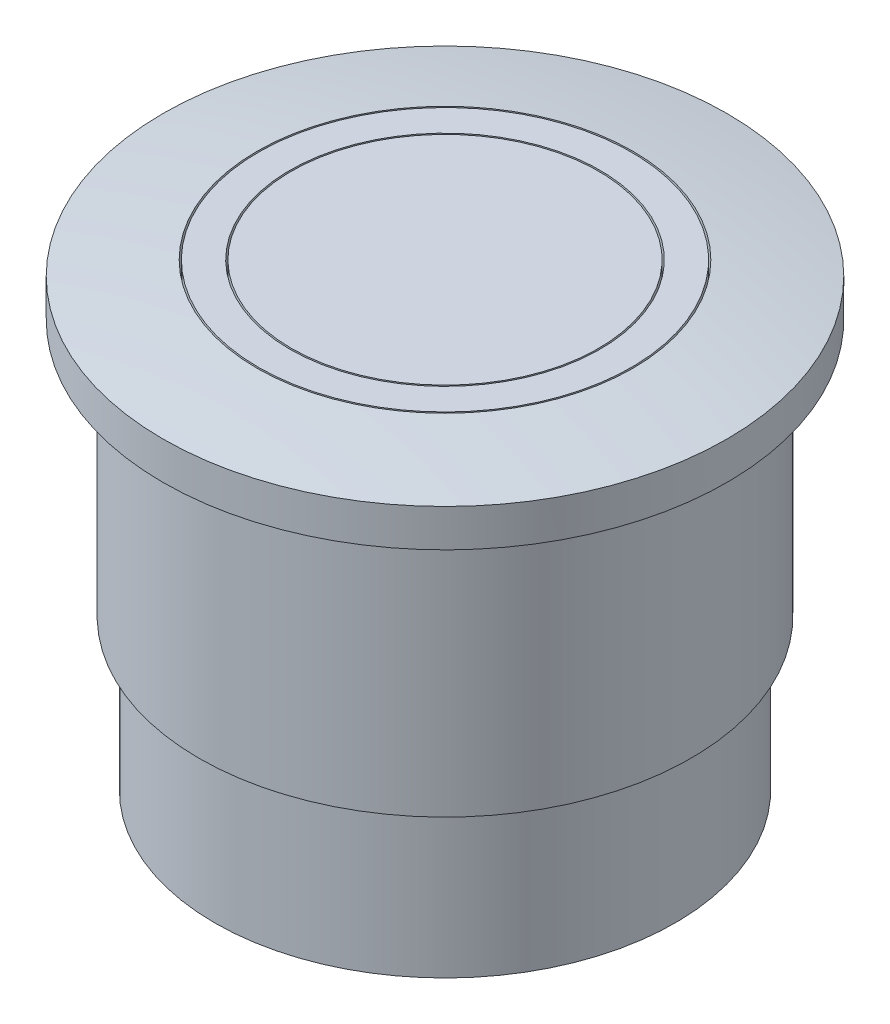
ISO-10303-21;
HEADER;
FILE_DESCRIPTION(('STEP AP214'),'2;1');
FILE_NAME('part.step','',(''),(''),'','','');
FILE_SCHEMA(('AUTOMOTIVE_DESIGN { 1 0 10303 214 1 1 1 1 }'));
ENDSEC;
DATA;
#1=APPLICATION_CONTEXT('core data for automotive mechanical design processes');
#2=APPLICATION_PROTOCOL_DEFINITION('international standard','automotive_design',2000,#1);
#3=PRODUCT_CONTEXT('',#1,'mechanical');
#4=PRODUCT('Part','Part','',(#3));
#5=PRODUCT_RELATED_PRODUCT_CATEGORY('part','',(#4));
#6=PRODUCT_DEFINITION_FORMATION('','',#4);
#7=PRODUCT_DEFINITION_CONTEXT('part definition',#1,'design');
#8=PRODUCT_DEFINITION('design','',#6,#7);
#9=PRODUCT_DEFINITION_SHAPE('','',#8);
#10=(LENGTH_UNIT() NAMED_UNIT(*) SI_UNIT(.MILLI.,.METRE.));
#11=(NAMED_UNIT(*) PLANE_ANGLE_UNIT() SI_UNIT($,.RADIAN.));
#12=(NAMED_UNIT(*) SI_UNIT($,.STERADIAN.) SOLID_ANGLE_UNIT());
#13=UNCERTAINTY_MEASURE_WITH_UNIT(LENGTH_MEASURE(1.E-05),#10,'distance_accuracy_value','');
#14=(GEOMETRIC_REPRESENTATION_CONTEXT(3) GLOBAL_UNCERTAINTY_ASSIGNED_CONTEXT((#13)) GLOBAL_UNIT_ASSIGNED_CONTEXT((#10,
#11,#12)) REPRESENTATION_CONTEXT('',''));
#15=CARTESIAN_POINT('',(0.,0.,0.));
#16=DIRECTION('',(0.,0.,1.));
#17=DIRECTION('',(1.,0.,0.));
#18=AXIS2_PLACEMENT_3D('',#15,#16,#17);
#19=CARTESIAN_POINT('',(0.,4.8,0.));
#20=DIRECTION('',(0.,-1.,0.));
#21=DIRECTION('',(0.,0.,-1.));
#22=AXIS2_PLACEMENT_3D('',#19,#20,#21);
#23=CYLINDRICAL_SURFACE('',#22,7.35);
#24=CARTESIAN_POINT('',(0.,4.8,0.));
#25=DIRECTION('',(0.,1.,0.));
#26=DIRECTION('',(0.,0.,1.));
#27=AXIS2_PLACEMENT_3D('',#24,#25,#26);
#28=CIRCLE('',#27,7.35);
#29=CARTESIAN_POINT('',(0.,4.8,7.35));
#30=VERTEX_POINT('',#29);
#31=EDGE_CURVE('E12',#30,#30,#28,.T.);
#32=ORIENTED_EDGE('',*,*,#31,.F.);
#33=EDGE_LOOP('',(#32));
#34=FACE_BOUND('',#33,.T.);
#35=CARTESIAN_POINT('',(0.,0.,0.));
#36=DIRECTION('',(0.,1.,0.));
#37=DIRECTION('',(0.,0.,1.));
#38=AXIS2_PLACEMENT_3D('',#35,#36,#37);
#39=CIRCLE('',#38,7.35);
#40=CARTESIAN_POINT('',(0.,0.,7.35));
#41=VERTEX_POINT('',#40);
#42=EDGE_CURVE('E46',#41,#41,#39,.T.);
#43=ORIENTED_EDGE('',*,*,#42,.T.);
#44=EDGE_LOOP('',(#43));
#45=FACE_BOUND('',#44,.T.);
#46=ADVANCED_FACE('F43',(#34,#45),#23,.T.);
#47=CARTESIAN_POINT('',(0.,0.,0.));
#48=DIRECTION('',(0.,1.,0.));
#49=DIRECTION('',(0.,0.,1.));
#50=AXIS2_PLACEMENT_3D('',#47,#48,#49);
#51=PLANE('',#50);
#52=ORIENTED_EDGE('',*,*,#42,.F.);
#53=EDGE_LOOP('',(#52));
#54=FACE_BOUND('',#53,.T.);
#55=ADVANCED_FACE('F130',(#54),#51,.F.);
#56=CARTESIAN_POINT('',(0.,48.2031529292576,0.));
#57=DIRECTION('',(0.,-1.,0.));
#58=DIRECTION('',(0.,0.,-1.));
#59=AXIS2_PLACEMENT_3D('',#56,#57,#58);
#60=CYLINDRICAL_SURFACE('',#59,7.85);
#61=CARTESIAN_POINT('',(0.,4.8,0.));
#62=DIRECTION('',(0.,1.,0.));
#63=DIRECTION('',(0.,0.,1.));
#64=AXIS2_PLACEMENT_3D('',#61,#62,#63);
#65=CIRCLE('',#64,7.85);
#66=CARTESIAN_POINT('',(0.,4.80000000000001,-7.85));
#67=VERTEX_POINT('',#66);
#68=EDGE_CURVE('E57',#67,#67,#65,.T.);
#69=CARTESIAN_POINT('',(0.,13.,0.));
#70=DIRECTION('',(0.,1.,0.));
#71=DIRECTION('',(0.,0.,1.));
#72=AXIS2_PLACEMENT_3D('',#69,#70,#71);
#73=CIRCLE('',#72,7.85);
#74=CARTESIAN_POINT('',(0.,13.,-7.85));
#75=VERTEX_POINT('',#74);
#76=EDGE_CURVE('E53',#75,#75,#73,.T.);
#77=CARTESIAN_POINT('',(0.,4.80000000000001,-7.85));
#78=CARTESIAN_POINT('',(0.,4.88541666666667,-7.85));
#79=CARTESIAN_POINT('',(0.,4.97083333333334,-7.85));
#80=CARTESIAN_POINT('',(0.,5.14166666666667,-7.85));
#81=CARTESIAN_POINT('',(0.,5.22708333333334,-7.85));
#82=CARTESIAN_POINT('',(0.,5.39791666666667,-7.85));
#83=CARTESIAN_POINT('',(0.,5.48333333333334,-7.85));
#84=CARTESIAN_POINT('',(0.,5.65416666666667,-7.85));
#85=CARTESIAN_POINT('',(0.,5.73958333333334,-7.85));
#86=CARTESIAN_POINT('',(0.,5.91041666666667,-7.85));
#87=CARTESIAN_POINT('',(0.,5.99583333333334,-7.85));
#88=CARTESIAN_POINT('',(0.,6.16666666666667,-7.85));
#89=CARTESIAN_POINT('',(0.,6.25208333333334,-7.85));
#90=CARTESIAN_POINT('',(0.,6.42291666666667,-7.85));
#91=CARTESIAN_POINT('',(0.,6.50833333333334,-7.85));
#92=CARTESIAN_POINT('',(0.,6.67916666666667,-7.85));
#93=CARTESIAN_POINT('',(0.,6.76458333333334,-7.85));
#94=CARTESIAN_POINT('',(0.,6.93541666666667,-7.85));
#95=CARTESIAN_POINT('',(0.,7.02083333333333,-7.85));
#96=CARTESIAN_POINT('',(0.,7.19166666666667,-7.85));
#97=CARTESIAN_POINT('',(0.,7.27708333333333,-7.85));
#98=CARTESIAN_POINT('',(0.,7.44791666666667,-7.85));
#99=CARTESIAN_POINT('',(0.,7.53333333333333,-7.85));
#100=CARTESIAN_POINT('',(0.,7.70416666666667,-7.85));
#101=CARTESIAN_POINT('',(0.,7.78958333333333,-7.85));
#102=CARTESIAN_POINT('',(0.,7.96041666666667,-7.85));
#103=CARTESIAN_POINT('',(0.,8.04583333333333,-7.85));
#104=CARTESIAN_POINT('',(0.,8.21666666666667,-7.85));
#105=CARTESIAN_POINT('',(0.,8.30208333333333,-7.85));
#106=CARTESIAN_POINT('',(0.,8.47291666666666,-7.85));
#107=CARTESIAN_POINT('',(0.,8.55833333333333,-7.85));
#108=CARTESIAN_POINT('',(0.,8.72916666666666,-7.85));
#109=CARTESIAN_POINT('',(0.,8.81458333333333,-7.85));
#110=CARTESIAN_POINT('',(0.,8.98541666666666,-7.85));
#111=CARTESIAN_POINT('',(0.,9.07083333333333,-7.85));
#112=CARTESIAN_POINT('',(0.,9.24166666666666,-7.85));
#113=CARTESIAN_POINT('',(0.,9.32708333333333,-7.85));
#114=CARTESIAN_POINT('',(0.,9.49791666666666,-7.85));
#115=CARTESIAN_POINT('',(0.,9.58333333333333,-7.85));
#116=CARTESIAN_POINT('',(0.,9.75416666666666,-7.85));
#117=CARTESIAN_POINT('',(0.,9.83958333333333,-7.85));
#118=CARTESIAN_POINT('',(0.,10.0104166666667,-7.85));
#119=CARTESIAN_POINT('',(0.,10.0958333333333,-7.85));
#120=CARTESIAN_POINT('',(0.,10.2666666666667,-7.85));
#121=CARTESIAN_POINT('',(0.,10.3520833333333,-7.85));
#122=CARTESIAN_POINT('',(0.,10.5229166666667,-7.85));
#123=CARTESIAN_POINT('',(0.,10.6083333333333,-7.85));
#124=CARTESIAN_POINT('',(0.,10.7791666666667,-7.85));
#125=CARTESIAN_POINT('',(0.,10.8645833333333,-7.85));
#126=CARTESIAN_POINT('',(0.,11.0354166666667,-7.85));
#127=CARTESIAN_POINT('',(0.,11.1208333333333,-7.85));
#128=CARTESIAN_POINT('',(0.,11.2916666666667,-7.85));
#129=CARTESIAN_POINT('',(0.,11.3770833333333,-7.85));
#130=CARTESIAN_POINT('',(0.,11.5479166666667,-7.85));
#131=CARTESIAN_POINT('',(0.,11.6333333333333,-7.85));
#132=CARTESIAN_POINT('',(0.,11.8041666666667,-7.85));
#133=CARTESIAN_POINT('',(0.,11.8895833333333,-7.85));
#134=CARTESIAN_POINT('',(0.,12.0604166666667,-7.85));
#135=CARTESIAN_POINT('',(0.,12.1458333333333,-7.85));
#136=CARTESIAN_POINT('',(0.,12.3166666666667,-7.85));
#137=CARTESIAN_POINT('',(0.,12.4020833333333,-7.85));
#138=CARTESIAN_POINT('',(0.,12.5729166666667,-7.85));
#139=CARTESIAN_POINT('',(0.,12.6583333333333,-7.85));
#140=CARTESIAN_POINT('',(0.,12.8291666666667,-7.85));
#141=CARTESIAN_POINT('',(0.,12.9145833333333,-7.85));
#142=CARTESIAN_POINT('',(0.,13.,-7.85));
#143=B_SPLINE_CURVE_WITH_KNOTS('',3,(#77,#78,#79,#80,#81,#82,#83,#84,#85,#86,#87,#88,#89,#90,
#91,#92,#93,#94,#95,#96,#97,#98,#99,#100,#101,#102,#103,#104,#105,#106,#107,#108,#109,#110,#111,
#112,#113,#114,#115,#116,#117,#118,#119,#120,#121,#122,#123,#124,#125,#126,#127,#128,#129,#130,
#131,#132,#133,#134,#135,#136,#137,#138,#139,#140,#141,#142),.UNSPECIFIED.,.F.,.F.,(4,2,2,2,2,2,
2,2,2,2,2,2,2,2,2,2,2,2,2,2,2,2,2,2,2,2,2,2,2,2,2,2,4),(0.,0.25625,0.512499999999999,
0.768749999999999,1.025,1.28125,1.5375,1.79375,2.05,2.30625,2.5625,2.81874999999999,
3.07499999999999,3.33124999999999,3.58749999999999,3.84374999999999,4.09999999999999,
4.35624999999999,4.61249999999999,4.86874999999999,5.12499999999999,5.38124999999999,
5.63749999999999,5.89374999999999,6.14999999999999,6.40624999999999,6.66249999999999,
6.91874999999999,7.17499999999999,7.43124999999999,7.68749999999999,7.94374999999999,
8.19999999999999),.UNSPECIFIED.);
#144=EDGE_CURVE('BSEAM135',#67,#75,#143,.T.);
#145=ORIENTED_EDGE('',*,*,#68,.T.);
#146=ORIENTED_EDGE('',*,*,#76,.F.);
#147=ORIENTED_EDGE('',*,*,#144,.T.);
#148=ORIENTED_EDGE('',*,*,#144,.F.);
#149=EDGE_LOOP('',(#145,#147,#146,#148));
#150=FACE_BOUND('',#149,.T.);
#151=ADVANCED_FACE('F135',(#150),#60,.T.);
#152=CARTESIAN_POINT('',(0.,4.8,0.));
#153=DIRECTION('',(0.,1.,0.));
#154=DIRECTION('',(0.,0.,1.));
#155=AXIS2_PLACEMENT_3D('',#152,#153,#154);
#156=PLANE('',#155);
#157=ORIENTED_EDGE('',*,*,#31,.T.);
#158=EDGE_LOOP('',(#157));
#159=FACE_BOUND('',#158,.T.);
#160=ORIENTED_EDGE('',*,*,#68,.F.);
#161=EDGE_LOOP('',(#160));
#162=FACE_BOUND('',#161,.T.);
#163=ADVANCED_FACE('F142',(#159,#162),#156,.F.);
#164=CARTESIAN_POINT('',(0.,-34.9833305094318,0.));
#165=DIRECTION('',(0.,1.,0.));
#166=DIRECTION('',(-1.,0.,0.));
#167=AXIS2_PLACEMENT_3D('',#164,#165,#166);
#168=SPHERICAL_SURFACE('',#167,50.);
#169=CARTESIAN_POINT('',(0.,14.2,0.));
#170=DIRECTION('',(0.,1.,0.));
#171=DIRECTION('',(0.,0.,1.));
#172=AXIS2_PLACEMENT_3D('',#169,#170,#171);
#173=CIRCLE('',#172,9.);
#174=CARTESIAN_POINT('',(-8.99999999999999,14.2,0.));
#175=VERTEX_POINT('',#174);
#176=EDGE_CURVE('E60',#175,#175,#173,.T.);
#177=CARTESIAN_POINT('',(0.,14.6553640745317,0.));
#178=DIRECTION('',(0.,1.,0.));
#179=DIRECTION('',(0.,0.,1.));
#180=AXIS2_PLACEMENT_3D('',#177,#178,#179);
#181=CIRCLE('',#180,6.);
#182=CARTESIAN_POINT('',(-6.00000000000002,14.6553640745317,0.));
#183=VERTEX_POINT('',#182);
#184=EDGE_CURVE('E67',#183,#183,#181,.T.);
#185=CARTESIAN_POINT('',(-8.99999999999999,14.2,0.));
#186=CARTESIAN_POINT('',(-8.96890354785455,14.205690303368,0.));
#187=CARTESIAN_POINT('',(-8.93780169910355,14.2113511152869,0.));
#188=CARTESIAN_POINT('',(-8.87558732031667,14.2226137360279,0.));
#189=CARTESIAN_POINT('',(-8.8444747902808,14.22821554485,0.));
#190=CARTESIAN_POINT('',(-8.78223916085046,14.2393601391989,0.));
#191=CARTESIAN_POINT('',(-8.75111606145599,14.2449029247256,0.));
#192=CARTESIAN_POINT('',(-8.68885940528303,14.2559294525543,0.));
#193=CARTESIAN_POINT('',(-8.65772584850454,14.2614131948562,0.));
#194=CARTESIAN_POINT('',(-8.595448389573,14.2723216165029,0.));
#195=CARTESIAN_POINT('',(-8.56430448741995,14.2777462958478,0.));
#196=CARTESIAN_POINT('',(-8.50200644978671,14.2885365720648,0.));
#197=CARTESIAN_POINT('',(-8.47085231430651,14.293902168937,0.));
#198=CARTESIAN_POINT('',(-8.40853392210299,14.3045742609045,0.));
#199=CARTESIAN_POINT('',(-8.37736966537967,14.3098807559998,0.));
#200=CARTESIAN_POINT('',(-8.31503114281042,14.3204346253222,0.));
#201=CARTESIAN_POINT('',(-8.28385687696448,14.3256819995494,0.));
#202=CARTESIAN_POINT('',(-8.22149844830647,14.3361176082569,0.));
#203=CARTESIAN_POINT('',(-8.1903142854944,14.3413058427373,0.));
#204=CARTESIAN_POINT('',(-8.12793617509622,14.3516231532854,0.));
#205=CARTESIAN_POINT('',(-8.09674222751012,14.3567522293532,0.));
#206=CARTESIAN_POINT('',(-8.0343446597912,14.3669512046231,0.));
#207=CARTESIAN_POINT('',(-8.00314103965838,14.3720211038252,0.));
#208=CARTESIAN_POINT('',(-7.94072423910811,14.3821017071237,0.));
#209=CARTESIAN_POINT('',(-7.90951105869067,14.3871124112201,0.));
#210=CARTESIAN_POINT('',(-7.84707524986766,14.3970746062799,0.));
#211=CARTESIAN_POINT('',(-7.8158526214621,14.4020260972434,0.));
#212=CARTESIAN_POINT('',(-7.75339802899335,14.4118698482233,0.));
#213=CARTESIAN_POINT('',(-7.72216606493016,14.4167621082398,0.));
#214=CARTESIAN_POINT('',(-7.65969291351024,14.4264873797247,0.));
#215=CARTESIAN_POINT('',(-7.62845172615349,14.4313203911932,0.));
#216=CARTESIAN_POINT('',(-7.56596024054372,14.4409271481942,0.));
#217=CARTESIAN_POINT('',(-7.53470994229069,14.4457008937268,0.));
#218=CARTESIAN_POINT('',(-7.47220034731837,14.4551891016814,0.));
#219=CARTESIAN_POINT('',(-7.44094105059909,14.4599035641035,0.));
#220=CARTESIAN_POINT('',(-7.37841357115669,14.4692731888758,0.));
#221=CARTESIAN_POINT('',(-7.34714538843357,14.473928351226,0.));
#222=CARTESIAN_POINT('',(-7.28460024947787,14.4831793591065,0.));
#223=CARTESIAN_POINT('',(-7.2533232932453,14.4877752046369,0.));
#224=CARTESIAN_POINT('',(-7.19076071979665,14.4969075623431,0.));
#225=CARTESIAN_POINT('',(-7.15947510258056,14.501444074519,0.));
#226=CARTESIAN_POINT('',(-7.096895319722,14.5104577491952,0.));
#227=CARTESIAN_POINT('',(-7.06560115407951,14.5149349116955,0.));
#228=CARTESIAN_POINT('',(-7.00300438695601,14.5238298709129,0.));
#229=CARTESIAN_POINT('',(-6.97170178547499,14.52824766763,0.));
#230=CARTESIAN_POINT('',(-6.90908825929262,14.5370238793869,0.));
#231=CARTESIAN_POINT('',(-6.87777733459127,14.5413822944268,0.));
#232=CARTESIAN_POINT('',(-6.81514727461641,14.5500397271489,0.));
#233=CARTESIAN_POINT('',(-6.78382813934289,14.5543387448312,0.));
#234=CARTESIAN_POINT('',(-6.72118177090139,14.5628773673714,0.));
#235=CARTESIAN_POINT('',(-6.6898545377334,14.5671169722294,0.));
#236=CARTESIAN_POINT('',(-6.62719208620978,14.575536753868,0.));
#237=CARTESIAN_POINT('',(-6.59585686785415,14.5797169306488,0.));
#238=CARTESIAN_POINT('',(-6.53317855869079,14.5880178410938,0.));
#239=CARTESIAN_POINT('',(-6.50183546788307,14.5921385747581,0.));
#240=CARTESIAN_POINT('',(-6.43914152657944,14.6003205841452,0.));
#241=CARTESIAN_POINT('',(-6.40779067608354,14.604381859868,0.));
#242=CARTESIAN_POINT('',(-6.34508132819524,14.61244493876,0.));
#243=CARTESIAN_POINT('',(-6.31372283080285,14.6164467419291,0.));
#244=CARTESIAN_POINT('',(-6.25099830194129,14.6243908613195,0.));
#245=CARTESIAN_POINT('',(-6.21963227047212,14.6283331775408,0.));
#246=CARTESIAN_POINT('',(-6.15689278630193,14.63615830884,0.));
#247=CARTESIAN_POINT('',(-6.12551933360091,14.6400411239179,0.));
#248=CARTESIAN_POINT('',(-6.06276511984568,14.6477472390064,0.));
#249=CARTESIAN_POINT('',(-6.03138435879148,14.6515705390169,0.));
#250=CARTESIAN_POINT('',(-6.00000000000002,14.6553640745317,0.));
#251=B_SPLINE_CURVE_WITH_KNOTS('',3,(#185,#186,#187,#188,#189,#190,#191,#192,#193,#194,#195,
#196,#197,#198,#199,#200,#201,#202,#203,#204,#205,#206,#207,#208,#209,#210,#211,#212,#213,#214,
#215,#216,#217,#218,#219,#220,#221,#222,#223,#224,#225,#226,#227,#228,#229,#230,#231,#232,#233,
#234,#235,#236,#237,#238,#239,#240,#241,#242,#243,#244,#245,#246,#247,#248,#249,#250),
.UNSPECIFIED.,.F.,.F.,(4,2,2,2,2,2,2,2,2,2,2,2,2,2,2,2,2,2,2,2,2,2,2,2,2,2,2,2,2,2,2,2,4),(0.,
0.0948383746140963,0.189676749228193,0.284515123842277,0.379353498456375,0.474191873070471,
0.569030247684566,0.663868622298662,0.758706996912747,0.853545371526843,0.94838374614094,
1.04322212075503,1.13806049536913,1.23289886998323,1.32773724459731,1.42257561921141,
1.5174139938255,1.6122523684396,1.7070907430537,1.80192911766778,1.89676749228188,
1.99160586689597,2.08644424151007,2.18128261612416,2.27612099073826,2.37095936535235,
2.46579773996644,2.56063611458054,2.65547448919463,2.75031286380873,2.84515123842282,
2.93998961303691,3.03482798765101),.UNSPECIFIED.);
#252=EDGE_CURVE('BSEAM147',#175,#183,#251,.T.);
#253=ORIENTED_EDGE('',*,*,#176,.T.);
#254=ORIENTED_EDGE('',*,*,#184,.F.);
#255=ORIENTED_EDGE('',*,*,#252,.T.);
#256=ORIENTED_EDGE('',*,*,#252,.F.);
#257=EDGE_LOOP('',(#253,#255,#254,#256));
#258=FACE_BOUND('',#257,.T.);
#259=ADVANCED_FACE('F147',(#258),#168,.T.);
#260=CARTESIAN_POINT('',(0.,15.2008910011442,0.));
#261=DIRECTION('',(0.,1.,0.));
#262=DIRECTION('',(0.,0.,1.));
#263=AXIS2_PLACEMENT_3D('',#260,#261,#262);
#264=CYLINDRICAL_SURFACE('',#263,9.);
#265=ORIENTED_EDGE('',*,*,#176,.F.);
#266=EDGE_LOOP('',(#265));
#267=FACE_BOUND('',#266,.T.);
#268=CARTESIAN_POINT('',(0.,13.,0.));
#269=DIRECTION('',(0.,1.,0.));
#270=DIRECTION('',(0.,0.,1.));
#271=AXIS2_PLACEMENT_3D('',#268,#269,#270);
#272=CIRCLE('',#271,9.);
#273=CARTESIAN_POINT('',(0.,13.,9.));
#274=VERTEX_POINT('',#273);
#275=EDGE_CURVE('E63',#274,#274,#272,.T.);
#276=ORIENTED_EDGE('',*,*,#275,.T.);
#277=EDGE_LOOP('',(#276));
#278=FACE_BOUND('',#277,.T.);
#279=ADVANCED_FACE('F126',(#267,#278),#264,.T.);
#280=CARTESIAN_POINT('',(-2.94148763317811E-13,13.,0.));
#281=DIRECTION('',(0.,1.,0.));
#282=DIRECTION('',(0.,0.,1.));
#283=AXIS2_PLACEMENT_3D('',#280,#281,#282);
#284=PLANE('',#283);
#285=ORIENTED_EDGE('',*,*,#76,.T.);
#286=EDGE_LOOP('',(#285));
#287=FACE_BOUND('',#286,.T.);
#288=ORIENTED_EDGE('',*,*,#275,.F.);
#289=EDGE_LOOP('',(#288));
#290=FACE_BOUND('',#289,.T.);
#291=ADVANCED_FACE('F117',(#287,#290),#284,.F.);
#292=CARTESIAN_POINT('',(0.,12.6553640745317,0.));
#293=DIRECTION('',(0.,1.,0.));
#294=DIRECTION('',(0.,0.,1.));
#295=AXIS2_PLACEMENT_3D('',#292,#293,#294);
#296=CYLINDRICAL_SURFACE('',#295,5.95);
#297=CARTESIAN_POINT('',(0.,12.6553640745317,0.));
#298=DIRECTION('',(0.,1.,0.));
#299=DIRECTION('',(0.,0.,1.));
#300=AXIS2_PLACEMENT_3D('',#297,#298,#299);
#301=CIRCLE('',#300,5.95);
#302=CARTESIAN_POINT('',(0.,12.6553640745317,5.95));
#303=VERTEX_POINT('',#302);
#304=EDGE_CURVE('E70',#303,#303,#301,.T.);
#305=ORIENTED_EDGE('',*,*,#304,.T.);
#306=EDGE_LOOP('',(#305));
#307=FACE_BOUND('',#306,.T.);
#308=CARTESIAN_POINT('',(0.,14.6553640745317,0.));
#309=DIRECTION('',(0.,1.,0.));
#310=DIRECTION('',(0.,0.,1.));
#311=AXIS2_PLACEMENT_3D('',#308,#309,#310);
#312=CIRCLE('',#311,5.95);
#313=CARTESIAN_POINT('',(0.,14.6553640745317,5.95));
#314=VERTEX_POINT('',#313);
#315=EDGE_CURVE('E71',#314,#314,#312,.T.);
#316=ORIENTED_EDGE('',*,*,#315,.F.);
#317=EDGE_LOOP('',(#316));
#318=FACE_BOUND('',#317,.T.);
#319=ADVANCED_FACE('F114',(#307,#318),#296,.T.);
#320=CARTESIAN_POINT('',(0.,12.6553640745317,0.));
#321=DIRECTION('',(0.,1.,0.));
#322=DIRECTION('',(0.,0.,1.));
#323=AXIS2_PLACEMENT_3D('',#320,#321,#322);
#324=CYLINDRICAL_SURFACE('',#323,6.);
#325=CARTESIAN_POINT('',(0.,12.6553640745317,0.));
#326=DIRECTION('',(0.,1.,0.));
#327=DIRECTION('',(0.,0.,1.));
#328=AXIS2_PLACEMENT_3D('',#325,#326,#327);
#329=CIRCLE('',#328,6.);
#330=CARTESIAN_POINT('',(0.,12.6553640745317,6.));
#331=VERTEX_POINT('',#330);
#332=EDGE_CURVE('E66',#331,#331,#329,.T.);
#333=ORIENTED_EDGE('',*,*,#332,.F.);
#334=EDGE_LOOP('',(#333));
#335=FACE_BOUND('',#334,.T.);
#336=ORIENTED_EDGE('',*,*,#184,.T.);
#337=EDGE_LOOP('',(#336));
#338=FACE_BOUND('',#337,.T.);
#339=ADVANCED_FACE('F116',(#335,#338),#324,.F.);
#340=CARTESIAN_POINT('',(0.,12.6553640745317,0.));
#341=DIRECTION('',(0.,1.,0.));
#342=DIRECTION('',(0.,0.,1.));
#343=AXIS2_PLACEMENT_3D('',#340,#341,#342);
#344=PLANE('',#343);
#345=ORIENTED_EDGE('',*,*,#304,.F.);
#346=EDGE_LOOP('',(#345));
#347=FACE_BOUND('',#346,.T.);
#348=ORIENTED_EDGE('',*,*,#332,.T.);
#349=EDGE_LOOP('',(#348));
#350=FACE_BOUND('',#349,.T.);
#351=ADVANCED_FACE('F110',(#347,#350),#344,.T.);
#352=CARTESIAN_POINT('',(0.,14.6553640745317,0.));
#353=DIRECTION('',(0.,-1.,0.));
#354=DIRECTION('',(0.,0.,-1.));
#355=AXIS2_PLACEMENT_3D('',#352,#353,#354);
#356=PLANE('',#355);
#357=CARTESIAN_POINT('',(0.,14.6553640745317,0.));
#358=DIRECTION('',(0.,1.,0.));
#359=DIRECTION('',(0.,0.,1.));
#360=AXIS2_PLACEMENT_3D('',#357,#358,#359);
#361=CIRCLE('',#360,4.95);
#362=CARTESIAN_POINT('',(0.,14.6553640745317,4.95));
#363=VERTEX_POINT('',#362);
#364=EDGE_CURVE('E79',#363,#363,#361,.T.);
#365=ORIENTED_EDGE('',*,*,#364,.F.);
#366=EDGE_LOOP('',(#365));
#367=FACE_BOUND('',#366,.T.);
#368=ORIENTED_EDGE('',*,*,#315,.T.);
#369=EDGE_LOOP('',(#368));
#370=FACE_BOUND('',#369,.T.);
#371=ADVANCED_FACE('F107',(#367,#370),#356,.F.);
#372=CARTESIAN_POINT('',(0.,12.6553640745317,0.));
#373=DIRECTION('',(0.,1.,0.));
#374=DIRECTION('',(0.,0.,1.));
#375=AXIS2_PLACEMENT_3D('',#372,#373,#374);
#376=CYLINDRICAL_SURFACE('',#375,4.9);
#377=CARTESIAN_POINT('',(0.,12.6553640745317,0.));
#378=DIRECTION('',(0.,1.,0.));
#379=DIRECTION('',(0.,0.,1.));
#380=AXIS2_PLACEMENT_3D('',#377,#378,#379);
#381=CIRCLE('',#380,4.9);
#382=CARTESIAN_POINT('',(0.,12.6553640745317,4.9));
#383=VERTEX_POINT('',#382);
#384=EDGE_CURVE('E82',#383,#383,#381,.T.);
#385=ORIENTED_EDGE('',*,*,#384,.T.);
#386=EDGE_LOOP('',(#385));
#387=FACE_BOUND('',#386,.T.);
#388=CARTESIAN_POINT('',(0.,14.6553640745317,0.));
#389=DIRECTION('',(0.,1.,0.));
#390=DIRECTION('',(0.,0.,1.));
#391=AXIS2_PLACEMENT_3D('',#388,#389,#390);
#392=CIRCLE('',#391,4.9);
#393=CARTESIAN_POINT('',(0.,14.6553640745317,4.9));
#394=VERTEX_POINT('',#393);
#395=EDGE_CURVE('E83',#394,#394,#392,.T.);
#396=ORIENTED_EDGE('',*,*,#395,.F.);
#397=EDGE_LOOP('',(#396));
#398=FACE_BOUND('',#397,.T.);
#399=ADVANCED_FACE('F91',(#387,#398),#376,.T.);
#400=CARTESIAN_POINT('',(0.,12.6553640745317,0.));
#401=DIRECTION('',(0.,1.,0.));
#402=DIRECTION('',(0.,0.,1.));
#403=AXIS2_PLACEMENT_3D('',#400,#401,#402);
#404=CYLINDRICAL_SURFACE('',#403,4.95);
#405=CARTESIAN_POINT('',(0.,12.6553640745317,0.));
#406=DIRECTION('',(0.,1.,0.));
#407=DIRECTION('',(0.,0.,1.));
#408=AXIS2_PLACEMENT_3D('',#405,#406,#407);
#409=CIRCLE('',#408,4.95);
#410=CARTESIAN_POINT('',(0.,12.6553640745317,4.95));
#411=VERTEX_POINT('',#410);
#412=EDGE_CURVE('E74',#411,#411,#409,.T.);
#413=ORIENTED_EDGE('',*,*,#412,.F.);
#414=EDGE_LOOP('',(#413));
#415=FACE_BOUND('',#414,.T.);
#416=ORIENTED_EDGE('',*,*,#364,.T.);
#417=EDGE_LOOP('',(#416));
#418=FACE_BOUND('',#417,.T.);
#419=ADVANCED_FACE('F98',(#415,#418),#404,.F.);
#420=CARTESIAN_POINT('',(0.,12.6553640745317,0.));
#421=DIRECTION('',(0.,1.,0.));
#422=DIRECTION('',(0.,0.,1.));
#423=AXIS2_PLACEMENT_3D('',#420,#421,#422);
#424=PLANE('',#423);
#425=ORIENTED_EDGE('',*,*,#384,.F.);
#426=EDGE_LOOP('',(#425));
#427=FACE_BOUND('',#426,.T.);
#428=ORIENTED_EDGE('',*,*,#412,.T.);
#429=EDGE_LOOP('',(#428));
#430=FACE_BOUND('',#429,.T.);
#431=ADVANCED_FACE('F94',(#427,#430),#424,.T.);
#432=ORIENTED_EDGE('',*,*,#395,.T.);
#433=EDGE_LOOP('',(#432));
#434=FACE_BOUND('',#433,.T.);
#435=ADVANCED_FACE('F97',(#434),#356,.F.);
#436=CLOSED_SHELL('',(#46,#55,#151,#163,#259,#279,#291,#319,#339,#351,#371,#399,#419,#431,#435));
#437=MANIFOLD_SOLID_BREP('B2',#436);
#438=ADVANCED_BREP_SHAPE_REPRESENTATION('',(#18,#437),#14);
#439=SHAPE_DEFINITION_REPRESENTATION(#9,#438);
ENDSEC;
END-ISO-10303-21;
